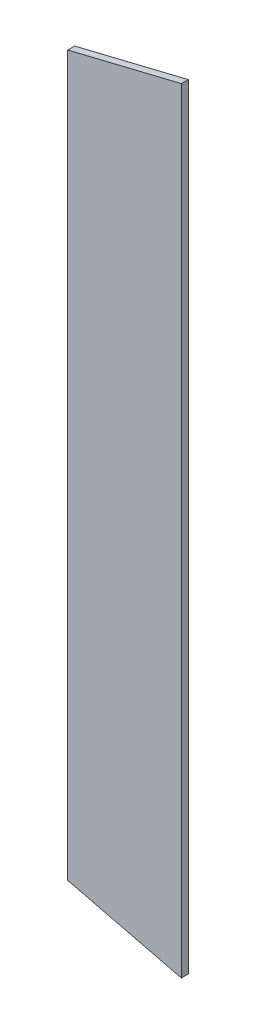
ISO-10303-21;
HEADER;
FILE_DESCRIPTION(('STEP AP214'),'2;1');
FILE_NAME('part.step','',(''),(''),'','','');
FILE_SCHEMA(('AUTOMOTIVE_DESIGN { 1 0 10303 214 1 1 1 1 }'));
ENDSEC;
DATA;
#1=APPLICATION_CONTEXT('core data for automotive mechanical design processes');
#2=APPLICATION_PROTOCOL_DEFINITION('international standard','automotive_design',2000,#1);
#3=PRODUCT_CONTEXT('',#1,'mechanical');
#4=PRODUCT('Part','Part','',(#3));
#5=PRODUCT_RELATED_PRODUCT_CATEGORY('part','',(#4));
#6=PRODUCT_DEFINITION_FORMATION('','',#4);
#7=PRODUCT_DEFINITION_CONTEXT('part definition',#1,'design');
#8=PRODUCT_DEFINITION('design','',#6,#7);
#9=PRODUCT_DEFINITION_SHAPE('','',#8);
#10=(LENGTH_UNIT() NAMED_UNIT(*) SI_UNIT(.MILLI.,.METRE.));
#11=(NAMED_UNIT(*) PLANE_ANGLE_UNIT() SI_UNIT($,.RADIAN.));
#12=(NAMED_UNIT(*) SI_UNIT($,.STERADIAN.) SOLID_ANGLE_UNIT());
#13=UNCERTAINTY_MEASURE_WITH_UNIT(LENGTH_MEASURE(1.E-05),#10,'distance_accuracy_value','');
#14=(GEOMETRIC_REPRESENTATION_CONTEXT(3) GLOBAL_UNCERTAINTY_ASSIGNED_CONTEXT((#13)) GLOBAL_UNIT_ASSIGNED_CONTEXT((#10,
#11,#12)) REPRESENTATION_CONTEXT('',''));
#15=CARTESIAN_POINT('',(0.,0.,0.));
#16=DIRECTION('',(0.,0.,1.));
#17=DIRECTION('',(1.,0.,0.));
#18=AXIS2_PLACEMENT_3D('',#15,#16,#17);
#19=CARTESIAN_POINT('',(0.41000172,-2.79500076,0.));
#20=DIRECTION('',(0.,0.,1.));
#21=DIRECTION('',(1.,0.,0.));
#22=AXIS2_PLACEMENT_3D('',#19,#20,#21);
#23=PLANE('',#22);
#24=DIRECTION('',(-0.971520507752064,-0.236955487417304,0.));
#25=VECTOR('',#24,1.);
#26=CARTESIAN_POINT('',(0.410001720000019,2.79500075999992,0.));
#27=LINE('',#26,#25);
#28=CARTESIAN_POINT('',(0.410001720000019,2.79500075999986,0.));
#29=VERTEX_POINT('',#28);
#30=CARTESIAN_POINT('',(-0.40999918,2.59500116,0.));
#31=VERTEX_POINT('',#30);
#32=EDGE_CURVE('E20',#29,#31,#27,.T.);
#33=ORIENTED_EDGE('',*,*,#32,.F.);
#34=DIRECTION('',(0.,1.,0.));
#35=VECTOR('',#34,1.);
#36=CARTESIAN_POINT('',(0.41000172,2.79500076,0.));
#37=LINE('',#36,#35);
#38=CARTESIAN_POINT('',(0.41000172,-2.79500076,0.));
#39=VERTEX_POINT('',#38);
#40=EDGE_CURVE('E69',#39,#29,#37,.T.);
#41=ORIENTED_EDGE('',*,*,#40,.F.);
#42=DIRECTION('',(0.97152050775213,-0.236955487417032,0.));
#43=VECTOR('',#42,1.);
#44=CARTESIAN_POINT('',(0.41000172,-2.79500076,0.));
#45=LINE('',#44,#43);
#46=CARTESIAN_POINT('',(-0.409999180000019,-2.59500116000014,0.));
#47=VERTEX_POINT('',#46);
#48=EDGE_CURVE('E56',#47,#39,#45,.T.);
#49=ORIENTED_EDGE('',*,*,#48,.F.);
#50=DIRECTION('',(0.,1.,0.));
#51=VECTOR('',#50,1.);
#52=CARTESIAN_POINT('',(-0.40999918,-2.59500116,0.));
#53=LINE('',#52,#51);
#54=EDGE_CURVE('E62',#31,#47,#53,.F.);
#55=ORIENTED_EDGE('',*,*,#54,.F.);
#56=EDGE_LOOP('',(#33,#41,#49,#55));
#57=FACE_BOUND('',#56,.T.);
#58=ADVANCED_FACE('F17',(#57),#23,.F.);
#59=CARTESIAN_POINT('',(-0.40999918,-2.59500116,0.));
#60=DIRECTION('',(-1.,0.,0.));
#61=DIRECTION('',(0.,0.,1.));
#62=AXIS2_PLACEMENT_3D('',#59,#60,#61);
#63=PLANE('',#62);
#64=DIRECTION('',(0.,0.,1.));
#65=VECTOR('',#64,1.);
#66=CARTESIAN_POINT('',(-0.409999180000075,-2.59500116000031,0.));
#67=LINE('',#66,#65);
#68=CARTESIAN_POINT('',(-0.409999180000019,-2.59500116000014,0.0499999));
#69=VERTEX_POINT('',#68);
#70=EDGE_CURVE('E64',#69,#47,#67,.F.);
#71=ORIENTED_EDGE('',*,*,#70,.F.);
#72=DIRECTION('',(0.,1.,0.));
#73=VECTOR('',#72,1.);
#74=CARTESIAN_POINT('',(-0.40999918,-2.79500076,0.0499999));
#75=LINE('',#74,#73);
#76=CARTESIAN_POINT('',(-0.40999918,2.59500116,0.0499999));
#77=VERTEX_POINT('',#76);
#78=EDGE_CURVE('E83',#77,#69,#75,.F.);
#79=ORIENTED_EDGE('',*,*,#78,.F.);
#80=DIRECTION('',(0.,0.,1.));
#81=VECTOR('',#80,1.);
#82=CARTESIAN_POINT('',(-0.40999918,2.59500116,0.));
#83=LINE('',#82,#81);
#84=EDGE_CURVE('E67',#31,#77,#83,.T.);
#85=ORIENTED_EDGE('',*,*,#84,.F.);
#86=ORIENTED_EDGE('',*,*,#54,.T.);
#87=EDGE_LOOP('',(#71,#79,#85,#86));
#88=FACE_BOUND('',#87,.T.);
#89=ADVANCED_FACE('F63',(#88),#63,.T.);
#90=CARTESIAN_POINT('',(0.41000172,-2.79500076,0.));
#91=DIRECTION('',(-0.236955487417032,-0.97152050775213,0.));
#92=DIRECTION('',(0.97152050775213,-0.236955487417032,0.));
#93=AXIS2_PLACEMENT_3D('',#90,#91,#92);
#94=PLANE('',#93);
#95=DIRECTION('',(0.,0.,-1.));
#96=VECTOR('',#95,1.);
#97=CARTESIAN_POINT('',(0.41000172,-2.79500076,0.));
#98=LINE('',#97,#96);
#99=CARTESIAN_POINT('',(0.41000172,-2.79500076,0.0499999));
#100=VERTEX_POINT('',#99);
#101=EDGE_CURVE('E71',#100,#39,#98,.T.);
#102=ORIENTED_EDGE('',*,*,#101,.F.);
#103=DIRECTION('',(0.971520507752064,-0.236955487417303,0.));
#104=VECTOR('',#103,1.);
#105=CARTESIAN_POINT('',(-0.409999180000019,-2.59500116000008,0.0499999));
#106=LINE('',#105,#104);
#107=EDGE_CURVE('E75',#69,#100,#106,.T.);
#108=ORIENTED_EDGE('',*,*,#107,.F.);
#109=ORIENTED_EDGE('',*,*,#70,.T.);
#110=ORIENTED_EDGE('',*,*,#48,.T.);
#111=EDGE_LOOP('',(#102,#108,#109,#110));
#112=FACE_BOUND('',#111,.T.);
#113=ADVANCED_FACE('F73',(#112),#94,.T.);
#114=CARTESIAN_POINT('',(0.41000172,2.79500076,0.));
#115=DIRECTION('',(1.,0.,0.));
#116=DIRECTION('',(0.,0.,-1.));
#117=AXIS2_PLACEMENT_3D('',#114,#115,#116);
#118=PLANE('',#117);
#119=DIRECTION('',(0.,0.,1.));
#120=VECTOR('',#119,1.);
#121=CARTESIAN_POINT('',(0.410001720000075,2.79500075999969,0.));
#122=LINE('',#121,#120);
#123=CARTESIAN_POINT('',(0.410001720000019,2.79500075999986,0.0499999));
#124=VERTEX_POINT('',#123);
#125=EDGE_CURVE('E35',#124,#29,#122,.F.);
#126=ORIENTED_EDGE('',*,*,#125,.F.);
#127=DIRECTION('',(0.,1.,0.));
#128=VECTOR('',#127,1.);
#129=CARTESIAN_POINT('',(0.41000172,-2.79500076,0.0499999));
#130=LINE('',#129,#128);
#131=EDGE_CURVE('E26',#100,#124,#130,.T.);
#132=ORIENTED_EDGE('',*,*,#131,.F.);
#133=ORIENTED_EDGE('',*,*,#101,.T.);
#134=ORIENTED_EDGE('',*,*,#40,.T.);
#135=EDGE_LOOP('',(#126,#132,#133,#134));
#136=FACE_BOUND('',#135,.T.);
#137=ADVANCED_FACE('F89',(#136),#118,.T.);
#138=CARTESIAN_POINT('',(-0.40999918,2.59500116,0.));
#139=DIRECTION('',(-0.236955487417032,0.97152050775213,0.));
#140=DIRECTION('',(-0.97152050775213,-0.236955487417032,0.));
#141=AXIS2_PLACEMENT_3D('',#138,#139,#140);
#142=PLANE('',#141);
#143=ORIENTED_EDGE('',*,*,#84,.T.);
#144=DIRECTION('',(-0.971520507752064,-0.236955487417304,0.));
#145=VECTOR('',#144,1.);
#146=CARTESIAN_POINT('',(0.410001720000019,2.79500075999992,0.0499999));
#147=LINE('',#146,#145);
#148=EDGE_CURVE('E11',#124,#77,#147,.T.);
#149=ORIENTED_EDGE('',*,*,#148,.F.);
#150=ORIENTED_EDGE('',*,*,#125,.T.);
#151=ORIENTED_EDGE('',*,*,#32,.T.);
#152=EDGE_LOOP('',(#143,#149,#150,#151));
#153=FACE_BOUND('',#152,.T.);
#154=ADVANCED_FACE('F91',(#153),#142,.T.);
#155=CARTESIAN_POINT('',(0.41000172,-2.79500076,0.0499999));
#156=DIRECTION('',(0.,0.,1.));
#157=DIRECTION('',(1.,0.,0.));
#158=AXIS2_PLACEMENT_3D('',#155,#156,#157);
#159=PLANE('',#158);
#160=ORIENTED_EDGE('',*,*,#131,.T.);
#161=ORIENTED_EDGE('',*,*,#148,.T.);
#162=ORIENTED_EDGE('',*,*,#78,.T.);
#163=ORIENTED_EDGE('',*,*,#107,.T.);
#164=EDGE_LOOP('',(#160,#161,#162,#163));
#165=FACE_BOUND('',#164,.T.);
#166=ADVANCED_FACE('F88',(#165),#159,.T.);
#167=CLOSED_SHELL('',(#58,#89,#113,#137,#154,#166));
#168=MANIFOLD_SOLID_BREP('B1',#167);
#169=ADVANCED_BREP_SHAPE_REPRESENTATION('',(#18,#168),#14);
#170=SHAPE_DEFINITION_REPRESENTATION(#9,#169);
ENDSEC;
END-ISO-10303-21;
